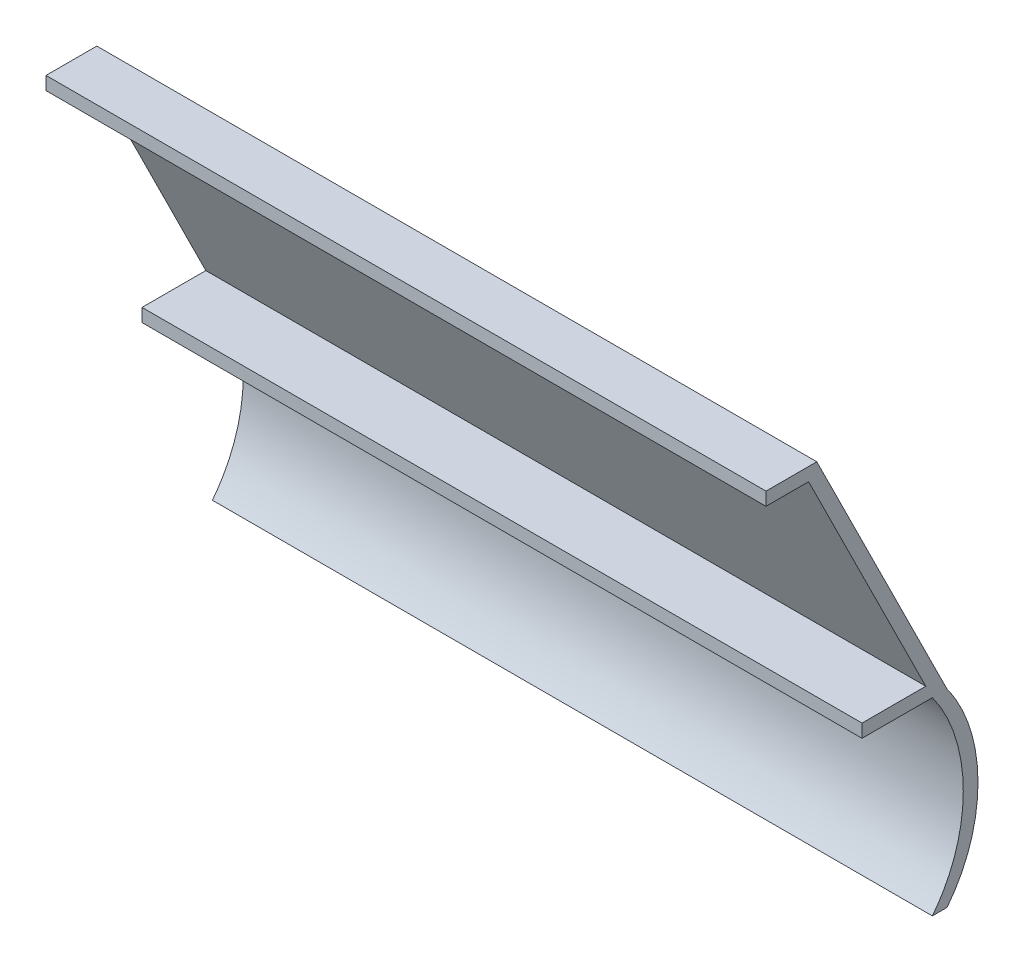
ISO-10303-21;
HEADER;
FILE_DESCRIPTION(('STEP AP214'),'2;1');
FILE_NAME('part.step','',(''),(''),'','','');
FILE_SCHEMA(('AUTOMOTIVE_DESIGN { 1 0 10303 214 1 1 1 1 }'));
ENDSEC;
DATA;
#1=APPLICATION_CONTEXT('core data for automotive mechanical design processes');
#2=APPLICATION_PROTOCOL_DEFINITION('international standard','automotive_design',2000,#1);
#3=PRODUCT_CONTEXT('',#1,'mechanical');
#4=PRODUCT('Part','Part','',(#3));
#5=PRODUCT_RELATED_PRODUCT_CATEGORY('part','',(#4));
#6=PRODUCT_DEFINITION_FORMATION('','',#4);
#7=PRODUCT_DEFINITION_CONTEXT('part definition',#1,'design');
#8=PRODUCT_DEFINITION('design','',#6,#7);
#9=PRODUCT_DEFINITION_SHAPE('','',#8);
#10=(LENGTH_UNIT() NAMED_UNIT(*) SI_UNIT(.MILLI.,.METRE.));
#11=(NAMED_UNIT(*) PLANE_ANGLE_UNIT() SI_UNIT($,.RADIAN.));
#12=(NAMED_UNIT(*) SI_UNIT($,.STERADIAN.) SOLID_ANGLE_UNIT());
#13=UNCERTAINTY_MEASURE_WITH_UNIT(LENGTH_MEASURE(1.E-05),#10,'distance_accuracy_value','');
#14=(GEOMETRIC_REPRESENTATION_CONTEXT(3) GLOBAL_UNCERTAINTY_ASSIGNED_CONTEXT((#13)) GLOBAL_UNIT_ASSIGNED_CONTEXT((#10,
#11,#12)) REPRESENTATION_CONTEXT('',''));
#15=CARTESIAN_POINT('',(0.,0.,0.));
#16=DIRECTION('',(0.,0.,1.));
#17=DIRECTION('',(1.,0.,0.));
#18=AXIS2_PLACEMENT_3D('',#15,#16,#17);
#19=CARTESIAN_POINT('',(163.8,0.,0.));
#20=DIRECTION('',(0.,1.,0.));
#21=DIRECTION('',(0.,0.,1.));
#22=AXIS2_PLACEMENT_3D('',#19,#20,#21);
#23=PLANE('',#22);
#24=DIRECTION('',(0.,0.,-1.));
#25=VECTOR('',#24,1.);
#26=CARTESIAN_POINT('',(0.,0.,0.));
#27=LINE('',#26,#25);
#28=CARTESIAN_POINT('',(0.,0.,0.));
#29=VERTEX_POINT('',#28);
#30=CARTESIAN_POINT('',(0.,0.,-9.7));
#31=VERTEX_POINT('',#30);
#32=EDGE_CURVE('E148',#29,#31,#27,.T.);
#33=ORIENTED_EDGE('',*,*,#32,.T.);
#34=DIRECTION('',(-1.,0.,0.));
#35=VECTOR('',#34,1.);
#36=CARTESIAN_POINT('',(163.8,0.,-9.7));
#37=LINE('',#36,#35);
#38=CARTESIAN_POINT('',(163.8,0.,-9.7));
#39=VERTEX_POINT('',#38);
#40=EDGE_CURVE('E11',#39,#31,#37,.T.);
#41=ORIENTED_EDGE('',*,*,#40,.F.);
#42=DIRECTION('',(0.,0.,-1.));
#43=VECTOR('',#42,1.);
#44=CARTESIAN_POINT('',(163.8,0.,0.));
#45=LINE('',#44,#43);
#46=CARTESIAN_POINT('',(163.8,0.,0.));
#47=VERTEX_POINT('',#46);
#48=EDGE_CURVE('E179',#47,#39,#45,.T.);
#49=ORIENTED_EDGE('',*,*,#48,.F.);
#50=DIRECTION('',(-1.,0.,0.));
#51=VECTOR('',#50,1.);
#52=CARTESIAN_POINT('',(163.8,0.,0.));
#53=LINE('',#52,#51);
#54=EDGE_CURVE('E144',#47,#29,#53,.T.);
#55=ORIENTED_EDGE('',*,*,#54,.T.);
#56=EDGE_LOOP('',(#33,#41,#49,#55));
#57=FACE_BOUND('',#56,.T.);
#58=ADVANCED_FACE('F35',(#57),#23,.F.);
#59=CARTESIAN_POINT('',(163.8,0.,-9.7));
#60=DIRECTION('',(0.,0.445125112588767,-0.895468388131506));
#61=DIRECTION('',(0.,0.895468388131506,0.445125112588767));
#62=AXIS2_PLACEMENT_3D('',#59,#60,#61);
#63=PLANE('',#62);
#64=DIRECTION('',(0.,-0.895468388131506,-0.445125112588767));
#65=VECTOR('',#64,1.);
#66=CARTESIAN_POINT('',(0.,0.,-9.7));
#67=LINE('',#66,#65);
#68=CARTESIAN_POINT('',(0.,-53.63,-36.3587409500265));
#69=VERTEX_POINT('',#68);
#70=EDGE_CURVE('E151',#31,#69,#67,.T.);
#71=ORIENTED_EDGE('',*,*,#70,.T.);
#72=DIRECTION('',(-1.,0.,0.));
#73=VECTOR('',#72,1.);
#74=CARTESIAN_POINT('',(163.8,-53.63,-36.3587409500265));
#75=LINE('',#74,#73);
#76=CARTESIAN_POINT('',(163.8,-53.63,-36.3587409500265));
#77=VERTEX_POINT('',#76);
#78=EDGE_CURVE('E43',#77,#69,#75,.T.);
#79=ORIENTED_EDGE('',*,*,#78,.F.);
#80=DIRECTION('',(0.,-0.895468388131506,-0.445125112588767));
#81=VECTOR('',#80,1.);
#82=CARTESIAN_POINT('',(163.8,0.,-9.7));
#83=LINE('',#82,#81);
#84=EDGE_CURVE('E103',#39,#77,#83,.T.);
#85=ORIENTED_EDGE('',*,*,#84,.F.);
#86=ORIENTED_EDGE('',*,*,#40,.T.);
#87=EDGE_LOOP('',(#71,#79,#85,#86));
#88=FACE_BOUND('',#87,.T.);
#89=ADVANCED_FACE('F247',(#88),#63,.F.);
#90=CARTESIAN_POINT('',(163.8,-53.63,-21.85));
#91=DIRECTION('',(0.,-1.,0.));
#92=DIRECTION('',(0.,0.,-1.));
#93=AXIS2_PLACEMENT_3D('',#90,#91,#92);
#94=PLANE('',#93);
#95=DIRECTION('',(0.,0.,1.));
#96=VECTOR('',#95,1.);
#97=CARTESIAN_POINT('',(0.,-53.63,-21.85));
#98=LINE('',#97,#96);
#99=CARTESIAN_POINT('',(0.,-53.63,-21.85));
#100=VERTEX_POINT('',#99);
#101=EDGE_CURVE('E153',#69,#100,#98,.T.);
#102=ORIENTED_EDGE('',*,*,#101,.T.);
#103=DIRECTION('',(-1.,0.,0.));
#104=VECTOR('',#103,1.);
#105=CARTESIAN_POINT('',(163.8,-53.63,-21.85));
#106=LINE('',#105,#104);
#107=CARTESIAN_POINT('',(163.8,-53.63,-21.85));
#108=VERTEX_POINT('',#107);
#109=EDGE_CURVE('E195',#108,#100,#106,.T.);
#110=ORIENTED_EDGE('',*,*,#109,.F.);
#111=DIRECTION('',(0.,0.,1.));
#112=VECTOR('',#111,1.);
#113=CARTESIAN_POINT('',(163.8,-53.63,-21.85));
#114=LINE('',#113,#112);
#115=EDGE_CURVE('E203',#77,#108,#114,.T.);
#116=ORIENTED_EDGE('',*,*,#115,.F.);
#117=ORIENTED_EDGE('',*,*,#78,.T.);
#118=EDGE_LOOP('',(#102,#110,#116,#117));
#119=FACE_BOUND('',#118,.T.);
#120=ADVANCED_FACE('F201',(#119),#94,.F.);
#121=CARTESIAN_POINT('',(163.8,-56.63,-21.85));
#122=DIRECTION('',(0.,0.,-1.));
#123=DIRECTION('',(-1.,0.,0.));
#124=AXIS2_PLACEMENT_3D('',#121,#122,#123);
#125=PLANE('',#124);
#126=DIRECTION('',(0.,-1.,0.));
#127=VECTOR('',#126,1.);
#128=CARTESIAN_POINT('',(0.,-56.63,-21.85));
#129=LINE('',#128,#127);
#130=CARTESIAN_POINT('',(0.,-56.63,-21.85));
#131=VERTEX_POINT('',#130);
#132=EDGE_CURVE('E155',#100,#131,#129,.T.);
#133=ORIENTED_EDGE('',*,*,#132,.T.);
#134=DIRECTION('',(-1.,0.,0.));
#135=VECTOR('',#134,1.);
#136=CARTESIAN_POINT('',(163.8,-56.63,-21.85));
#137=LINE('',#136,#135);
#138=CARTESIAN_POINT('',(163.8,-56.63,-21.85));
#139=VERTEX_POINT('',#138);
#140=EDGE_CURVE('E192',#139,#131,#137,.T.);
#141=ORIENTED_EDGE('',*,*,#140,.F.);
#142=DIRECTION('',(0.,-1.,0.));
#143=VECTOR('',#142,1.);
#144=CARTESIAN_POINT('',(163.8,-56.63,-21.85));
#145=LINE('',#144,#143);
#146=EDGE_CURVE('E221',#108,#139,#145,.T.);
#147=ORIENTED_EDGE('',*,*,#146,.F.);
#148=ORIENTED_EDGE('',*,*,#109,.T.);
#149=EDGE_LOOP('',(#133,#141,#147,#148));
#150=FACE_BOUND('',#149,.T.);
#151=ADVANCED_FACE('F212',(#150),#125,.F.);
#152=CARTESIAN_POINT('',(163.8,-56.63,-37.85));
#153=DIRECTION('',(0.,1.,0.));
#154=DIRECTION('',(0.,0.,1.));
#155=AXIS2_PLACEMENT_3D('',#152,#153,#154);
#156=PLANE('',#155);
#157=DIRECTION('',(0.,0.,-1.));
#158=VECTOR('',#157,1.);
#159=CARTESIAN_POINT('',(0.,-56.63,-37.85));
#160=LINE('',#159,#158);
#161=CARTESIAN_POINT('',(0.,-56.63,-37.85));
#162=VERTEX_POINT('',#161);
#163=EDGE_CURVE('E157',#131,#162,#160,.T.);
#164=ORIENTED_EDGE('',*,*,#163,.T.);
#165=DIRECTION('',(-1.,0.,0.));
#166=VECTOR('',#165,1.);
#167=CARTESIAN_POINT('',(163.8,-56.63,-37.85));
#168=LINE('',#167,#166);
#169=CARTESIAN_POINT('',(163.8,-56.63,-37.85));
#170=VERTEX_POINT('',#169);
#171=EDGE_CURVE('E189',#170,#162,#168,.T.);
#172=ORIENTED_EDGE('',*,*,#171,.F.);
#173=DIRECTION('',(0.,0.,-1.));
#174=VECTOR('',#173,1.);
#175=CARTESIAN_POINT('',(163.8,-56.63,-37.85));
#176=LINE('',#175,#174);
#177=EDGE_CURVE('E218',#139,#170,#176,.T.);
#178=ORIENTED_EDGE('',*,*,#177,.F.);
#179=ORIENTED_EDGE('',*,*,#140,.T.);
#180=EDGE_LOOP('',(#164,#172,#178,#179));
#181=FACE_BOUND('',#180,.T.);
#182=ADVANCED_FACE('F216',(#181),#156,.F.);
#183=CARTESIAN_POINT('',(163.8,-56.63,-37.85));
#184=CARTESIAN_POINT('',(163.8,-69.0607121666385,-46.9539825534366));
#185=CARTESIAN_POINT('',(163.8,-87.4221529017239,-47.4997915017362));
#186=CARTESIAN_POINT('',(163.8,-99.63,-37.85));
#187=B_SPLINE_CURVE_WITH_KNOTS('',3,(#183,#184,#185,#186),.UNSPECIFIED.,.F.,.F.,(4,4),(0.,1.),.UNSPECIFIED.);
#188=DIRECTION('',(-1.,0.,0.));
#189=VECTOR('',#188,1.);
#190=SURFACE_OF_LINEAR_EXTRUSION('',#187,#189);
#191=CARTESIAN_POINT('',(0.,-56.63,-37.85));
#192=CARTESIAN_POINT('',(0.,-69.0607121666385,-46.9539825534366));
#193=CARTESIAN_POINT('',(0.,-87.4221529017239,-47.4997915017362));
#194=CARTESIAN_POINT('',(0.,-99.63,-37.85));
#195=B_SPLINE_CURVE_WITH_KNOTS('',3,(#191,#192,#193,#194),.UNSPECIFIED.,.F.,.F.,(4,4),(0.,1.),.UNSPECIFIED.);
#196=CARTESIAN_POINT('',(0.,-99.63,-37.85));
#197=VERTEX_POINT('',#196);
#198=EDGE_CURVE('E159',#162,#197,#195,.T.);
#199=ORIENTED_EDGE('',*,*,#198,.T.);
#200=DIRECTION('',(-1.,0.,0.));
#201=VECTOR('',#200,1.);
#202=CARTESIAN_POINT('',(163.8,-99.63,-37.85));
#203=LINE('',#202,#201);
#204=CARTESIAN_POINT('',(163.8,-99.63,-37.85));
#205=VERTEX_POINT('',#204);
#206=EDGE_CURVE('E186',#205,#197,#203,.T.);
#207=ORIENTED_EDGE('',*,*,#206,.F.);
#208=EDGE_CURVE('E220',#170,#205,#187,.T.);
#209=ORIENTED_EDGE('',*,*,#208,.F.);
#210=ORIENTED_EDGE('',*,*,#171,.T.);
#211=EDGE_LOOP('',(#199,#207,#209,#210));
#212=FACE_BOUND('',#211,.T.);
#213=ADVANCED_FACE('F235',(#212),#190,.F.);
#214=CARTESIAN_POINT('',(163.8,-99.63,-41.200202016913));
#215=DIRECTION('',(0.,1.,0.));
#216=DIRECTION('',(0.,0.,1.));
#217=AXIS2_PLACEMENT_3D('',#214,#215,#216);
#218=PLANE('',#217);
#219=DIRECTION('',(0.,0.,-1.));
#220=VECTOR('',#219,1.);
#221=CARTESIAN_POINT('',(0.,-99.63,-41.200202016913));
#222=LINE('',#221,#220);
#223=CARTESIAN_POINT('',(0.,-99.63,-41.200202016913));
#224=VERTEX_POINT('',#223);
#225=EDGE_CURVE('E163',#197,#224,#222,.T.);
#226=ORIENTED_EDGE('',*,*,#225,.T.);
#227=DIRECTION('',(-1.,0.,0.));
#228=VECTOR('',#227,1.);
#229=CARTESIAN_POINT('',(163.8,-99.63,-41.200202016913));
#230=LINE('',#229,#228);
#231=CARTESIAN_POINT('',(163.8,-99.63,-41.200202016913));
#232=VERTEX_POINT('',#231);
#233=EDGE_CURVE('E183',#232,#224,#230,.T.);
#234=ORIENTED_EDGE('',*,*,#233,.F.);
#235=DIRECTION('',(0.,0.,-1.));
#236=VECTOR('',#235,1.);
#237=CARTESIAN_POINT('',(163.8,-99.63,-41.200202016913));
#238=LINE('',#237,#236);
#239=EDGE_CURVE('E223',#205,#232,#238,.T.);
#240=ORIENTED_EDGE('',*,*,#239,.F.);
#241=ORIENTED_EDGE('',*,*,#206,.T.);
#242=EDGE_LOOP('',(#226,#234,#240,#241));
#243=FACE_BOUND('',#242,.T.);
#244=ADVANCED_FACE('F239',(#243),#218,.F.);
#245=CARTESIAN_POINT('',(163.8,-99.63,-41.200202016913));
#246=CARTESIAN_POINT('',(163.8,-87.422152901724,-50.8499935186491));
#247=CARTESIAN_POINT('',(163.8,-69.0607121666384,-50.3041845703496));
#248=CARTESIAN_POINT('',(163.8,-56.63,-41.200202016913));
#249=B_SPLINE_CURVE_WITH_KNOTS('',3,(#245,#246,#247,#248),.UNSPECIFIED.,.F.,.F.,(4,4),(0.,1.),.UNSPECIFIED.);
#250=DIRECTION('',(-1.,0.,0.));
#251=VECTOR('',#250,1.);
#252=SURFACE_OF_LINEAR_EXTRUSION('',#249,#251);
#253=CARTESIAN_POINT('',(0.,-99.63,-41.200202016913));
#254=CARTESIAN_POINT('',(0.,-87.422152901724,-50.8499935186491));
#255=CARTESIAN_POINT('',(0.,-69.0607121666384,-50.3041845703496));
#256=CARTESIAN_POINT('',(0.,-56.63,-41.200202016913));
#257=B_SPLINE_CURVE_WITH_KNOTS('',3,(#253,#254,#255,#256),.UNSPECIFIED.,.F.,.F.,(4,4),(0.,1.),.UNSPECIFIED.);
#258=CARTESIAN_POINT('',(0.,-56.63,-41.200202016913));
#259=VERTEX_POINT('',#258);
#260=EDGE_CURVE('E168',#224,#259,#257,.T.);
#261=ORIENTED_EDGE('',*,*,#260,.T.);
#262=DIRECTION('',(-1.,0.,0.));
#263=VECTOR('',#262,1.);
#264=CARTESIAN_POINT('',(163.8,-56.63,-41.200202016913));
#265=LINE('',#264,#263);
#266=CARTESIAN_POINT('',(163.8,-56.63,-41.200202016913));
#267=VERTEX_POINT('',#266);
#268=EDGE_CURVE('E139',#267,#259,#265,.T.);
#269=ORIENTED_EDGE('',*,*,#268,.F.);
#270=EDGE_CURVE('E131',#232,#267,#249,.T.);
#271=ORIENTED_EDGE('',*,*,#270,.F.);
#272=ORIENTED_EDGE('',*,*,#233,.T.);
#273=EDGE_LOOP('',(#261,#269,#271,#272));
#274=FACE_BOUND('',#273,.T.);
#275=ADVANCED_FACE('F258',(#274),#252,.F.);
#276=CARTESIAN_POINT('',(163.8,0.31636686421917,-12.8929403671201));
#277=DIRECTION('',(0.,-0.445125112588766,0.895468388131506));
#278=DIRECTION('',(0.,-0.895468388131506,-0.445125112588767));
#279=AXIS2_PLACEMENT_3D('',#276,#277,#278);
#280=PLANE('',#279);
#281=DIRECTION('',(0.,0.895468388131506,0.445125112588767));
#282=VECTOR('',#281,1.);
#283=CARTESIAN_POINT('',(0.,0.31636686421917,-12.8929403671201));
#284=LINE('',#283,#282);
#285=CARTESIAN_POINT('',(0.,3.,-11.5589429669395));
#286=VERTEX_POINT('',#285);
#287=EDGE_CURVE('E138',#259,#286,#284,.T.);
#288=ORIENTED_EDGE('',*,*,#287,.T.);
#289=DIRECTION('',(-1.,0.,0.));
#290=VECTOR('',#289,1.);
#291=CARTESIAN_POINT('',(163.8,3.,-11.5589429669395));
#292=LINE('',#291,#290);
#293=CARTESIAN_POINT('',(163.8,3.,-11.5589429669395));
#294=VERTEX_POINT('',#293);
#295=EDGE_CURVE('E136',#294,#286,#292,.T.);
#296=ORIENTED_EDGE('',*,*,#295,.F.);
#297=DIRECTION('',(0.,0.895468388131507,0.445125112588766));
#298=VECTOR('',#297,1.);
#299=CARTESIAN_POINT('',(163.8,-56.3136331357808,-41.0429403671201));
#300=LINE('',#299,#298);
#301=EDGE_CURVE('E125',#267,#294,#300,.T.);
#302=ORIENTED_EDGE('',*,*,#301,.F.);
#303=ORIENTED_EDGE('',*,*,#268,.T.);
#304=EDGE_LOOP('',(#288,#296,#302,#303));
#305=FACE_BOUND('',#304,.T.);
#306=ADVANCED_FACE('F137',(#305),#280,.F.);
#307=CARTESIAN_POINT('',(163.8,3.,0.));
#308=DIRECTION('',(0.,-1.,0.));
#309=DIRECTION('',(0.,0.,-1.));
#310=AXIS2_PLACEMENT_3D('',#307,#308,#309);
#311=PLANE('',#310);
#312=DIRECTION('',(0.,0.,1.));
#313=VECTOR('',#312,1.);
#314=CARTESIAN_POINT('',(0.,3.,0.));
#315=LINE('',#314,#313);
#316=CARTESIAN_POINT('',(0.,3.,0.));
#317=VERTEX_POINT('',#316);
#318=EDGE_CURVE('E89',#286,#317,#315,.T.);
#319=ORIENTED_EDGE('',*,*,#318,.T.);
#320=DIRECTION('',(-1.,0.,0.));
#321=VECTOR('',#320,1.);
#322=CARTESIAN_POINT('',(163.8,3.,0.));
#323=LINE('',#322,#321);
#324=CARTESIAN_POINT('',(163.8,3.,0.));
#325=VERTEX_POINT('',#324);
#326=EDGE_CURVE('E140',#325,#317,#323,.T.);
#327=ORIENTED_EDGE('',*,*,#326,.F.);
#328=DIRECTION('',(0.,0.,1.));
#329=VECTOR('',#328,1.);
#330=CARTESIAN_POINT('',(163.8,3.,0.));
#331=LINE('',#330,#329);
#332=EDGE_CURVE('E129',#294,#325,#331,.T.);
#333=ORIENTED_EDGE('',*,*,#332,.F.);
#334=ORIENTED_EDGE('',*,*,#295,.T.);
#335=EDGE_LOOP('',(#319,#327,#333,#334));
#336=FACE_BOUND('',#335,.T.);
#337=ADVANCED_FACE('F142',(#336),#311,.F.);
#338=CARTESIAN_POINT('',(163.8,0.,0.));
#339=DIRECTION('',(0.,0.,-1.));
#340=DIRECTION('',(-1.,0.,0.));
#341=AXIS2_PLACEMENT_3D('',#338,#339,#340);
#342=PLANE('',#341);
#343=DIRECTION('',(0.,-1.,0.));
#344=VECTOR('',#343,1.);
#345=CARTESIAN_POINT('',(0.,0.,0.));
#346=LINE('',#345,#344);
#347=EDGE_CURVE('E95',#317,#29,#346,.T.);
#348=ORIENTED_EDGE('',*,*,#347,.T.);
#349=ORIENTED_EDGE('',*,*,#54,.F.);
#350=DIRECTION('',(0.,-1.,0.));
#351=VECTOR('',#350,1.);
#352=CARTESIAN_POINT('',(163.8,0.,0.));
#353=LINE('',#352,#351);
#354=EDGE_CURVE('E51',#325,#47,#353,.T.);
#355=ORIENTED_EDGE('',*,*,#354,.F.);
#356=ORIENTED_EDGE('',*,*,#326,.T.);
#357=EDGE_LOOP('',(#348,#349,#355,#356));
#358=FACE_BOUND('',#357,.T.);
#359=ADVANCED_FACE('F275',(#358),#342,.F.);
#360=CARTESIAN_POINT('',(163.8,-78.2135744006359,-44.8826652706898));
#361=DIRECTION('',(1.,0.,0.));
#362=DIRECTION('',(0.,0.,-1.));
#363=AXIS2_PLACEMENT_3D('',#360,#361,#362);
#364=PLANE('',#363);
#365=ORIENTED_EDGE('',*,*,#48,.T.);
#366=ORIENTED_EDGE('',*,*,#84,.T.);
#367=ORIENTED_EDGE('',*,*,#115,.T.);
#368=ORIENTED_EDGE('',*,*,#146,.T.);
#369=ORIENTED_EDGE('',*,*,#177,.T.);
#370=ORIENTED_EDGE('',*,*,#208,.T.);
#371=ORIENTED_EDGE('',*,*,#239,.T.);
#372=ORIENTED_EDGE('',*,*,#270,.T.);
#373=ORIENTED_EDGE('',*,*,#301,.T.);
#374=ORIENTED_EDGE('',*,*,#332,.T.);
#375=ORIENTED_EDGE('',*,*,#354,.T.);
#376=EDGE_LOOP('',(#365,#366,#367,#368,#369,#370,#371,#372,#373,#374,#375));
#377=FACE_BOUND('',#376,.T.);
#378=ADVANCED_FACE('F127',(#377),#364,.T.);
#379=CARTESIAN_POINT('',(0.,-78.2135744006359,-44.8826652706898));
#380=DIRECTION('',(1.,0.,0.));
#381=DIRECTION('',(0.,0.,-1.));
#382=AXIS2_PLACEMENT_3D('',#379,#380,#381);
#383=PLANE('',#382);
#384=ORIENTED_EDGE('',*,*,#32,.F.);
#385=ORIENTED_EDGE('',*,*,#347,.F.);
#386=ORIENTED_EDGE('',*,*,#318,.F.);
#387=ORIENTED_EDGE('',*,*,#287,.F.);
#388=ORIENTED_EDGE('',*,*,#260,.F.);
#389=ORIENTED_EDGE('',*,*,#225,.F.);
#390=ORIENTED_EDGE('',*,*,#198,.F.);
#391=ORIENTED_EDGE('',*,*,#163,.F.);
#392=ORIENTED_EDGE('',*,*,#132,.F.);
#393=ORIENTED_EDGE('',*,*,#101,.F.);
#394=ORIENTED_EDGE('',*,*,#70,.F.);
#395=EDGE_LOOP('',(#384,#385,#386,#387,#388,#389,#390,#391,#392,#393,#394));
#396=FACE_BOUND('',#395,.T.);
#397=ADVANCED_FACE('F207',(#396),#383,.F.);
#398=CLOSED_SHELL('',(#58,#89,#120,#151,#182,#213,#244,#275,#306,#337,#359,#378,#397));
#399=MANIFOLD_SOLID_BREP('B2',#398);
#400=ADVANCED_BREP_SHAPE_REPRESENTATION('',(#18,#399),#14);
#401=SHAPE_DEFINITION_REPRESENTATION(#9,#400);
ENDSEC;
END-ISO-10303-21;
